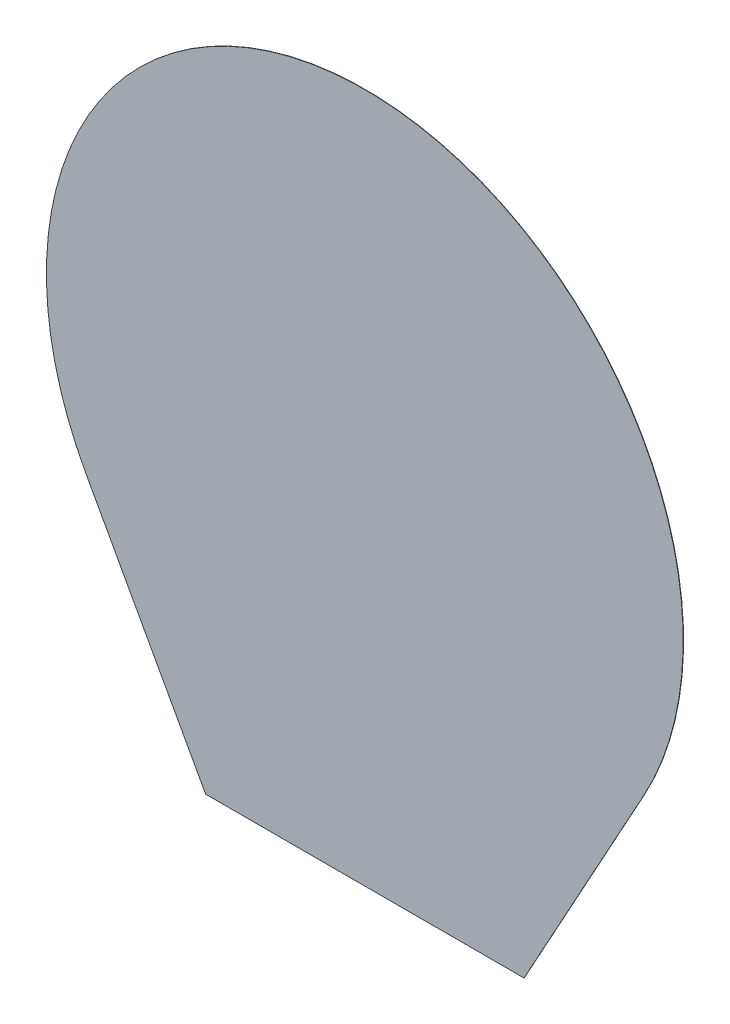
ISO-10303-21;
HEADER;
FILE_DESCRIPTION(('STEP AP214'),'2;1');
FILE_NAME('part.step','',(''),(''),'','','');
FILE_SCHEMA(('AUTOMOTIVE_DESIGN { 1 0 10303 214 1 1 1 1 }'));
ENDSEC;
DATA;
#1=APPLICATION_CONTEXT('core data for automotive mechanical design processes');
#2=APPLICATION_PROTOCOL_DEFINITION('international standard','automotive_design',2000,#1);
#3=PRODUCT_CONTEXT('',#1,'mechanical');
#4=PRODUCT('Part','Part','',(#3));
#5=PRODUCT_RELATED_PRODUCT_CATEGORY('part','',(#4));
#6=PRODUCT_DEFINITION_FORMATION('','',#4);
#7=PRODUCT_DEFINITION_CONTEXT('part definition',#1,'design');
#8=PRODUCT_DEFINITION('design','',#6,#7);
#9=PRODUCT_DEFINITION_SHAPE('','',#8);
#10=(LENGTH_UNIT() NAMED_UNIT(*) SI_UNIT(.MILLI.,.METRE.));
#11=(NAMED_UNIT(*) PLANE_ANGLE_UNIT() SI_UNIT($,.RADIAN.));
#12=(NAMED_UNIT(*) SI_UNIT($,.STERADIAN.) SOLID_ANGLE_UNIT());
#13=UNCERTAINTY_MEASURE_WITH_UNIT(LENGTH_MEASURE(1.E-05),#10,'distance_accuracy_value','');
#14=(GEOMETRIC_REPRESENTATION_CONTEXT(3) GLOBAL_UNCERTAINTY_ASSIGNED_CONTEXT((#13)) GLOBAL_UNIT_ASSIGNED_CONTEXT((#10,
#11,#12)) REPRESENTATION_CONTEXT('',''));
#15=CARTESIAN_POINT('',(0.,0.,0.));
#16=DIRECTION('',(0.,0.,1.));
#17=DIRECTION('',(1.,0.,0.));
#18=AXIS2_PLACEMENT_3D('',#15,#16,#17);
#19=CARTESIAN_POINT('',(26.2928846577311,-14.4459065612114,0.03556));
#20=DIRECTION('',(-0.876429488591035,0.481530218707047,0.));
#21=DIRECTION('',(-0.481530218707047,-0.876429488591036,0.));
#22=AXIS2_PLACEMENT_3D('',#19,#20,#21);
#23=PLANE('',#22);
#24=DIRECTION('',(0.481530218707047,0.876429488591035,0.));
#25=VECTOR('',#24,1.);
#26=CARTESIAN_POINT('',(26.2928846577311,-14.4459065612114,0.));
#27=LINE('',#26,#25);
#28=CARTESIAN_POINT('',(15.,-35.0000000340328,0.));
#29=VERTEX_POINT('',#28);
#30=CARTESIAN_POINT('',(26.2928846577311,-14.4459065612114,0.));
#31=VERTEX_POINT('',#30);
#32=EDGE_CURVE('E112',#29,#31,#27,.T.);
#33=ORIENTED_EDGE('',*,*,#32,.T.);
#34=DIRECTION('',(0.,0.,-1.));
#35=VECTOR('',#34,1.);
#36=CARTESIAN_POINT('',(26.2928846577311,-14.4459065612114,0.03556));
#37=LINE('',#36,#35);
#38=CARTESIAN_POINT('',(26.2928846577311,-14.4459065612114,0.03556));
#39=VERTEX_POINT('',#38);
#40=EDGE_CURVE('E11',#39,#31,#37,.T.);
#41=ORIENTED_EDGE('',*,*,#40,.F.);
#42=DIRECTION('',(0.481530218707047,0.876429488591035,0.));
#43=VECTOR('',#42,1.);
#44=CARTESIAN_POINT('',(26.2928846577311,-14.4459065612114,0.03556));
#45=LINE('',#44,#43);
#46=CARTESIAN_POINT('',(15.,-35.0000000340328,0.03556));
#47=VERTEX_POINT('',#46);
#48=EDGE_CURVE('E93',#47,#39,#45,.T.);
#49=ORIENTED_EDGE('',*,*,#48,.F.);
#50=DIRECTION('',(0.,0.,-1.));
#51=VECTOR('',#50,1.);
#52=CARTESIAN_POINT('',(15.,-35.0000000340328,0.03556));
#53=LINE('',#52,#51);
#54=EDGE_CURVE('E108',#47,#29,#53,.T.);
#55=ORIENTED_EDGE('',*,*,#54,.T.);
#56=EDGE_LOOP('',(#33,#41,#49,#55));
#57=FACE_BOUND('',#56,.T.);
#58=ADVANCED_FACE('F45',(#57),#23,.F.);
#59=CARTESIAN_POINT('',(0.,0.,0.03556));
#60=DIRECTION('',(0.,0.,-1.));
#61=DIRECTION('',(-1.,0.,0.));
#62=AXIS2_PLACEMENT_3D('',#59,#60,#61);
#63=CYLINDRICAL_SURFACE('',#62,30.);
#64=CARTESIAN_POINT('',(0.,0.,0.));
#65=DIRECTION('',(0.,0.,1.));
#66=DIRECTION('',(1.,0.,0.));
#67=AXIS2_PLACEMENT_3D('',#64,#65,#66);
#68=CIRCLE('',#67,30.);
#69=CARTESIAN_POINT('',(-26.2928846577311,-14.4459065612114,0.));
#70=VERTEX_POINT('',#69);
#71=EDGE_CURVE('E99',#31,#70,#68,.T.);
#72=ORIENTED_EDGE('',*,*,#71,.T.);
#73=DIRECTION('',(0.,0.,-1.));
#74=VECTOR('',#73,1.);
#75=CARTESIAN_POINT('',(-26.2928846577311,-14.4459065612114,0.03556));
#76=LINE('',#75,#74);
#77=CARTESIAN_POINT('',(-26.2928846577311,-14.4459065612114,0.03556));
#78=VERTEX_POINT('',#77);
#79=EDGE_CURVE('E54',#78,#70,#76,.T.);
#80=ORIENTED_EDGE('',*,*,#79,.F.);
#81=CARTESIAN_POINT('',(0.,0.,0.03556));
#82=DIRECTION('',(0.,0.,1.));
#83=DIRECTION('',(1.,0.,0.));
#84=AXIS2_PLACEMENT_3D('',#81,#82,#83);
#85=CIRCLE('',#84,30.);
#86=EDGE_CURVE('E88',#39,#78,#85,.T.);
#87=ORIENTED_EDGE('',*,*,#86,.F.);
#88=ORIENTED_EDGE('',*,*,#40,.T.);
#89=EDGE_LOOP('',(#72,#80,#87,#88));
#90=FACE_BOUND('',#89,.T.);
#91=ADVANCED_FACE('F98',(#90),#63,.T.);
#92=CARTESIAN_POINT('',(-26.2928846577311,-14.4459065612114,0.03556));
#93=DIRECTION('',(-0.876429488591035,-0.481530218707047,0.));
#94=DIRECTION('',(0.481530218707047,-0.876429488591035,0.));
#95=AXIS2_PLACEMENT_3D('',#92,#93,#94);
#96=PLANE('',#95);
#97=DIRECTION('',(-0.481530218707047,0.876429488591035,0.));
#98=VECTOR('',#97,1.);
#99=CARTESIAN_POINT('',(-26.2928846577311,-14.4459065612114,0.));
#100=LINE('',#99,#98);
#101=CARTESIAN_POINT('',(-15.,-35.0000000340328,0.));
#102=VERTEX_POINT('',#101);
#103=EDGE_CURVE('E118',#102,#70,#100,.T.);
#104=ORIENTED_EDGE('',*,*,#103,.F.);
#105=DIRECTION('',(0.,0.,-1.));
#106=VECTOR('',#105,1.);
#107=CARTESIAN_POINT('',(-15.,-35.0000000340328,0.03556));
#108=LINE('',#107,#106);
#109=CARTESIAN_POINT('',(-15.,-35.0000000340328,0.03556));
#110=VERTEX_POINT('',#109);
#111=EDGE_CURVE('E78',#110,#102,#108,.T.);
#112=ORIENTED_EDGE('',*,*,#111,.F.);
#113=DIRECTION('',(-0.481530218707047,0.876429488591035,0.));
#114=VECTOR('',#113,1.);
#115=CARTESIAN_POINT('',(-26.2928846577311,-14.4459065612114,0.03556));
#116=LINE('',#115,#114);
#117=EDGE_CURVE('E91',#110,#78,#116,.T.);
#118=ORIENTED_EDGE('',*,*,#117,.T.);
#119=ORIENTED_EDGE('',*,*,#79,.T.);
#120=EDGE_LOOP('',(#104,#112,#118,#119));
#121=FACE_BOUND('',#120,.T.);
#122=ADVANCED_FACE('F104',(#121),#96,.T.);
#123=CARTESIAN_POINT('',(0.,-35.0000000340328,0.03556));
#124=DIRECTION('',(0.,1.,0.));
#125=DIRECTION('',(-1.,0.,0.));
#126=AXIS2_PLACEMENT_3D('',#123,#124,#125);
#127=PLANE('',#126);
#128=DIRECTION('',(1.,0.,0.));
#129=VECTOR('',#128,1.);
#130=CARTESIAN_POINT('',(0.,-35.0000000340328,0.));
#131=LINE('',#130,#129);
#132=EDGE_CURVE('E81',#102,#29,#131,.T.);
#133=ORIENTED_EDGE('',*,*,#132,.T.);
#134=ORIENTED_EDGE('',*,*,#54,.F.);
#135=DIRECTION('',(1.,0.,0.));
#136=VECTOR('',#135,1.);
#137=CARTESIAN_POINT('',(0.,-35.0000000340328,0.03556));
#138=LINE('',#137,#136);
#139=EDGE_CURVE('E62',#110,#47,#138,.T.);
#140=ORIENTED_EDGE('',*,*,#139,.F.);
#141=ORIENTED_EDGE('',*,*,#111,.T.);
#142=EDGE_LOOP('',(#133,#134,#140,#141));
#143=FACE_BOUND('',#142,.T.);
#144=ADVANCED_FACE('F135',(#143),#127,.F.);
#145=CARTESIAN_POINT('',(0.,0.,0.03556));
#146=DIRECTION('',(0.,0.,1.));
#147=DIRECTION('',(1.,0.,0.));
#148=AXIS2_PLACEMENT_3D('',#145,#146,#147);
#149=PLANE('',#148);
#150=ORIENTED_EDGE('',*,*,#48,.T.);
#151=ORIENTED_EDGE('',*,*,#86,.T.);
#152=ORIENTED_EDGE('',*,*,#117,.F.);
#153=ORIENTED_EDGE('',*,*,#139,.T.);
#154=EDGE_LOOP('',(#150,#151,#152,#153));
#155=FACE_BOUND('',#154,.T.);
#156=ADVANCED_FACE('F89',(#155),#149,.T.);
#157=CARTESIAN_POINT('',(0.,0.,0.));
#158=DIRECTION('',(0.,0.,1.));
#159=DIRECTION('',(1.,0.,0.));
#160=AXIS2_PLACEMENT_3D('',#157,#158,#159);
#161=PLANE('',#160);
#162=ORIENTED_EDGE('',*,*,#32,.F.);
#163=ORIENTED_EDGE('',*,*,#132,.F.);
#164=ORIENTED_EDGE('',*,*,#103,.T.);
#165=ORIENTED_EDGE('',*,*,#71,.F.);
#166=EDGE_LOOP('',(#162,#163,#164,#165));
#167=FACE_BOUND('',#166,.T.);
#168=ADVANCED_FACE('F129',(#167),#161,.F.);
#169=CLOSED_SHELL('',(#58,#91,#122,#144,#156,#168));
#170=MANIFOLD_SOLID_BREP('B2',#169);
#171=ADVANCED_BREP_SHAPE_REPRESENTATION('',(#18,#170),#14);
#172=SHAPE_DEFINITION_REPRESENTATION(#9,#171);
ENDSEC;
END-ISO-10303-21;
